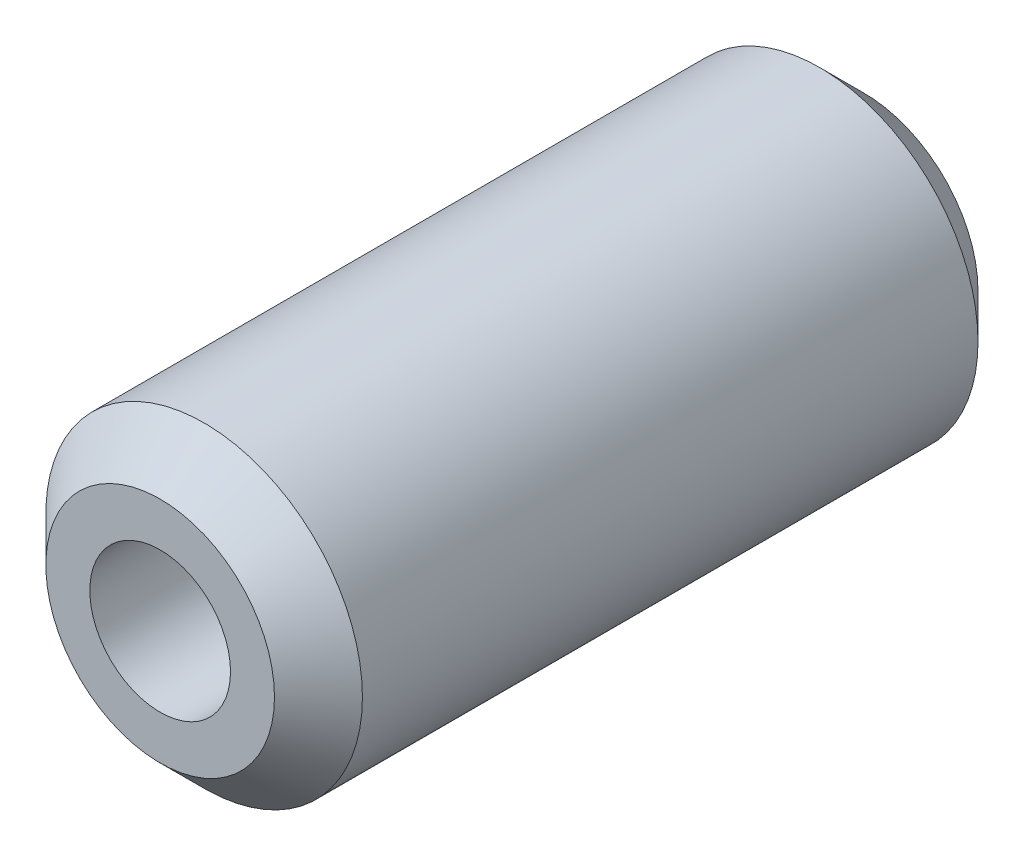
ISO-10303-21;
HEADER;
FILE_DESCRIPTION(('STEP AP214'),'2;1');
FILE_NAME('part.step','',(''),(''),'','','');
FILE_SCHEMA(('AUTOMOTIVE_DESIGN { 1 0 10303 214 1 1 1 1 }'));
ENDSEC;
DATA;
#1=APPLICATION_CONTEXT('core data for automotive mechanical design processes');
#2=APPLICATION_PROTOCOL_DEFINITION('international standard','automotive_design',2000,#1);
#3=PRODUCT_CONTEXT('',#1,'mechanical');
#4=PRODUCT('Part','Part','',(#3));
#5=PRODUCT_RELATED_PRODUCT_CATEGORY('part','',(#4));
#6=PRODUCT_DEFINITION_FORMATION('','',#4);
#7=PRODUCT_DEFINITION_CONTEXT('part definition',#1,'design');
#8=PRODUCT_DEFINITION('design','',#6,#7);
#9=PRODUCT_DEFINITION_SHAPE('','',#8);
#10=(LENGTH_UNIT() NAMED_UNIT(*) SI_UNIT(.MILLI.,.METRE.));
#11=(NAMED_UNIT(*) PLANE_ANGLE_UNIT() SI_UNIT($,.RADIAN.));
#12=(NAMED_UNIT(*) SI_UNIT($,.STERADIAN.) SOLID_ANGLE_UNIT());
#13=UNCERTAINTY_MEASURE_WITH_UNIT(LENGTH_MEASURE(1.E-05),#10,'distance_accuracy_value','');
#14=(GEOMETRIC_REPRESENTATION_CONTEXT(3) GLOBAL_UNCERTAINTY_ASSIGNED_CONTEXT((#13)) GLOBAL_UNIT_ASSIGNED_CONTEXT((#10,
#11,#12)) REPRESENTATION_CONTEXT('',''));
#15=CARTESIAN_POINT('',(0.,0.,0.));
#16=DIRECTION('',(0.,0.,1.));
#17=DIRECTION('',(1.,0.,0.));
#18=AXIS2_PLACEMENT_3D('',#15,#16,#17);
#19=CARTESIAN_POINT('',(0.,0.,20.));
#20=DIRECTION('',(0.,0.,1.));
#21=DIRECTION('',(1.,0.,0.));
#22=AXIS2_PLACEMENT_3D('',#19,#20,#21);
#23=PLANE('',#22);
#24=CARTESIAN_POINT('',(0.,0.,20.));
#25=DIRECTION('',(0.,0.,1.));
#26=DIRECTION('',(1.,0.,0.));
#27=AXIS2_PLACEMENT_3D('',#24,#25,#26);
#28=CIRCLE('',#27,6.49999999999999);
#29=CARTESIAN_POINT('',(6.49999999999999,0.,20.));
#30=VERTEX_POINT('',#29);
#31=EDGE_CURVE('E10',#30,#30,#28,.T.);
#32=ORIENTED_EDGE('',*,*,#31,.T.);
#33=EDGE_LOOP('',(#32));
#34=FACE_BOUND('',#33,.T.);
#35=CARTESIAN_POINT('',(0.,0.,20.));
#36=DIRECTION('',(0.,0.,1.));
#37=DIRECTION('',(1.,0.,0.));
#38=AXIS2_PLACEMENT_3D('',#35,#36,#37);
#39=CIRCLE('',#38,4.);
#40=CARTESIAN_POINT('',(4.,0.,20.));
#41=VERTEX_POINT('',#40);
#42=EDGE_CURVE('E64',#41,#41,#39,.T.);
#43=ORIENTED_EDGE('',*,*,#42,.F.);
#44=EDGE_LOOP('',(#43));
#45=FACE_BOUND('',#44,.T.);
#46=ADVANCED_FACE('F39',(#34,#45),#23,.T.);
#47=CARTESIAN_POINT('',(0.,0.,-20.));
#48=DIRECTION('',(0.,0.,1.));
#49=DIRECTION('',(1.,0.,0.));
#50=AXIS2_PLACEMENT_3D('',#47,#48,#49);
#51=PLANE('',#50);
#52=CARTESIAN_POINT('',(0.,0.,-20.));
#53=DIRECTION('',(0.,0.,1.));
#54=DIRECTION('',(1.,0.,0.));
#55=AXIS2_PLACEMENT_3D('',#52,#53,#54);
#56=CIRCLE('',#55,6.49999999999998);
#57=CARTESIAN_POINT('',(6.49999999999998,0.,-20.));
#58=VERTEX_POINT('',#57);
#59=EDGE_CURVE('E48',#58,#58,#56,.F.);
#60=ORIENTED_EDGE('',*,*,#59,.T.);
#61=EDGE_LOOP('',(#60));
#62=FACE_BOUND('',#61,.T.);
#63=CARTESIAN_POINT('',(0.,0.,-20.));
#64=DIRECTION('',(0.,0.,1.));
#65=DIRECTION('',(1.,0.,0.));
#66=AXIS2_PLACEMENT_3D('',#63,#64,#65);
#67=CIRCLE('',#66,4.);
#68=CARTESIAN_POINT('',(4.,0.,-20.));
#69=VERTEX_POINT('',#68);
#70=EDGE_CURVE('E65',#69,#69,#67,.T.);
#71=ORIENTED_EDGE('',*,*,#70,.T.);
#72=EDGE_LOOP('',(#71));
#73=FACE_BOUND('',#72,.T.);
#74=ADVANCED_FACE('F77',(#62,#73),#51,.F.);
#75=CARTESIAN_POINT('',(0.,0.,20.));
#76=DIRECTION('',(0.,0.,-1.));
#77=DIRECTION('',(-1.,0.,0.));
#78=AXIS2_PLACEMENT_3D('',#75,#76,#77);
#79=CYLINDRICAL_SURFACE('',#78,9.);
#80=CARTESIAN_POINT('',(0.,0.,-17.5));
#81=DIRECTION('',(0.,0.,1.));
#82=DIRECTION('',(1.,0.,0.));
#83=AXIS2_PLACEMENT_3D('',#80,#81,#82);
#84=CIRCLE('',#83,9.);
#85=CARTESIAN_POINT('',(9.,0.,-17.5));
#86=VERTEX_POINT('',#85);
#87=EDGE_CURVE('E53',#86,#86,#84,.T.);
#88=ORIENTED_EDGE('',*,*,#87,.T.);
#89=EDGE_LOOP('',(#88));
#90=FACE_BOUND('',#89,.T.);
#91=CARTESIAN_POINT('',(0.,0.,17.5));
#92=DIRECTION('',(0.,0.,1.));
#93=DIRECTION('',(1.,0.,0.));
#94=AXIS2_PLACEMENT_3D('',#91,#92,#93);
#95=CIRCLE('',#94,9.);
#96=CARTESIAN_POINT('',(9.,0.,17.5));
#97=VERTEX_POINT('',#96);
#98=EDGE_CURVE('E58',#97,#97,#95,.F.);
#99=ORIENTED_EDGE('',*,*,#98,.T.);
#100=EDGE_LOOP('',(#99));
#101=FACE_BOUND('',#100,.T.);
#102=ADVANCED_FACE('F82',(#90,#101),#79,.T.);
#103=CARTESIAN_POINT('',(0.,0.,20.));
#104=DIRECTION('',(0.,0.,-1.));
#105=DIRECTION('',(-1.,0.,0.));
#106=AXIS2_PLACEMENT_3D('',#103,#104,#105);
#107=CYLINDRICAL_SURFACE('',#106,4.);
#108=ORIENTED_EDGE('',*,*,#42,.T.);
#109=EDGE_LOOP('',(#108));
#110=FACE_BOUND('',#109,.T.);
#111=ORIENTED_EDGE('',*,*,#70,.F.);
#112=EDGE_LOOP('',(#111));
#113=FACE_BOUND('',#112,.T.);
#114=ADVANCED_FACE('F73',(#110,#113),#107,.F.);
#115=CARTESIAN_POINT('',(0.,0.,-17.5));
#116=DIRECTION('',(0.,0.,1.));
#117=DIRECTION('',(1.,0.,0.));
#118=AXIS2_PLACEMENT_3D('',#115,#116,#117);
#119=CONICAL_SURFACE('',#118,9.,0.785398163397451);
#120=ORIENTED_EDGE('',*,*,#59,.F.);
#121=EDGE_LOOP('',(#120));
#122=FACE_BOUND('',#121,.T.);
#123=ORIENTED_EDGE('',*,*,#87,.F.);
#124=EDGE_LOOP('',(#123));
#125=FACE_BOUND('',#124,.T.);
#126=ADVANCED_FACE('F89',(#122,#125),#119,.T.);
#127=CARTESIAN_POINT('',(0.,0.,20.));
#128=DIRECTION('',(0.,0.,-1.));
#129=DIRECTION('',(-1.,0.,0.));
#130=AXIS2_PLACEMENT_3D('',#127,#128,#129);
#131=CONICAL_SURFACE('',#130,6.49999999999999,0.785398163397447);
#132=ORIENTED_EDGE('',*,*,#98,.F.);
#133=EDGE_LOOP('',(#132));
#134=FACE_BOUND('',#133,.T.);
#135=ORIENTED_EDGE('',*,*,#31,.F.);
#136=EDGE_LOOP('',(#135));
#137=FACE_BOUND('',#136,.T.);
#138=ADVANCED_FACE('F42',(#134,#137),#131,.T.);
#139=CLOSED_SHELL('',(#46,#74,#102,#114,#126,#138));
#140=MANIFOLD_SOLID_BREP('B2',#139);
#141=ADVANCED_BREP_SHAPE_REPRESENTATION('',(#18,#140),#14);
#142=SHAPE_DEFINITION_REPRESENTATION(#9,#141);
ENDSEC;
END-ISO-10303-21;
